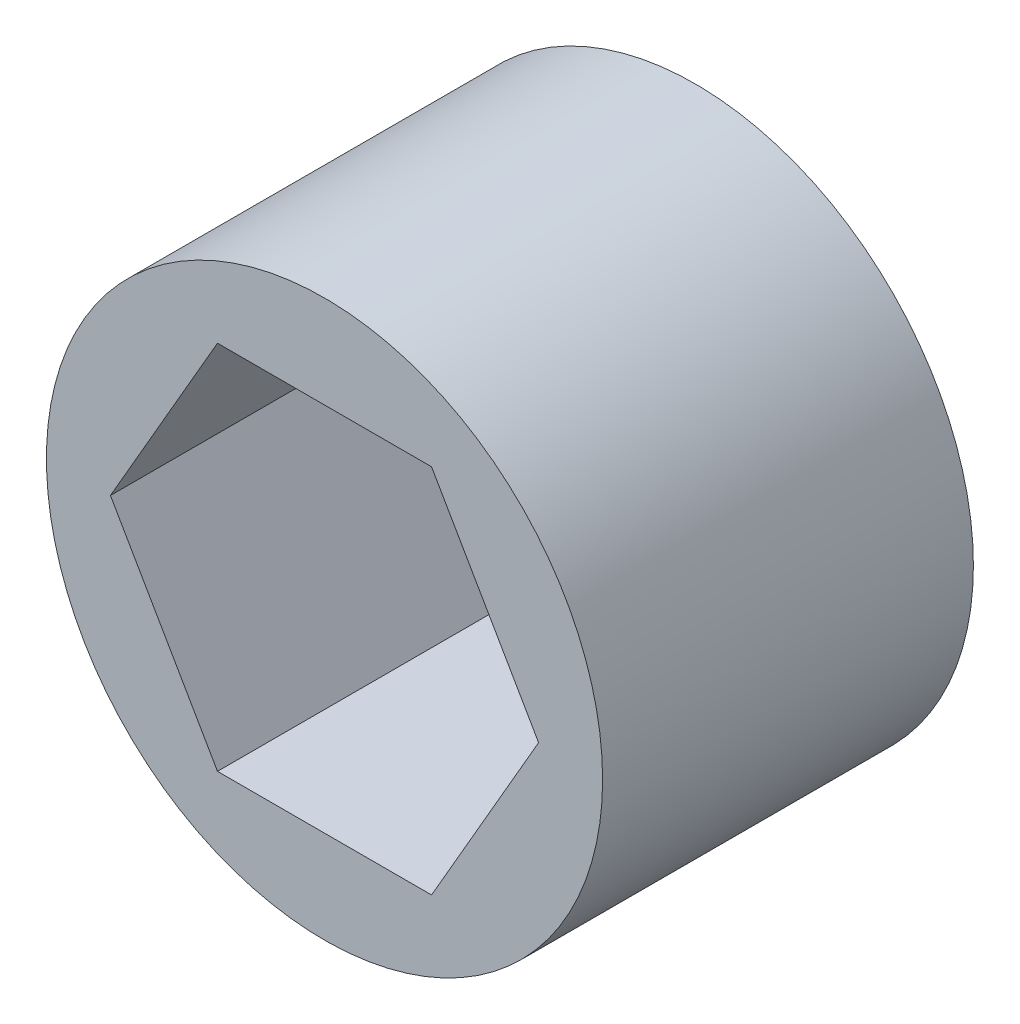
ISO-10303-21;
HEADER;
FILE_DESCRIPTION(('STEP AP214'),'2;1');
FILE_NAME('part.step','',(''),(''),'','','');
FILE_SCHEMA(('AUTOMOTIVE_DESIGN { 1 0 10303 214 1 1 1 1 }'));
ENDSEC;
DATA;
#1=APPLICATION_CONTEXT('core data for automotive mechanical design processes');
#2=APPLICATION_PROTOCOL_DEFINITION('international standard','automotive_design',2000,#1);
#3=PRODUCT_CONTEXT('',#1,'mechanical');
#4=PRODUCT('Part','Part','',(#3));
#5=PRODUCT_RELATED_PRODUCT_CATEGORY('part','',(#4));
#6=PRODUCT_DEFINITION_FORMATION('','',#4);
#7=PRODUCT_DEFINITION_CONTEXT('part definition',#1,'design');
#8=PRODUCT_DEFINITION('design','',#6,#7);
#9=PRODUCT_DEFINITION_SHAPE('','',#8);
#10=(LENGTH_UNIT() NAMED_UNIT(*) SI_UNIT(.MILLI.,.METRE.));
#11=(NAMED_UNIT(*) PLANE_ANGLE_UNIT() SI_UNIT($,.RADIAN.));
#12=(NAMED_UNIT(*) SI_UNIT($,.STERADIAN.) SOLID_ANGLE_UNIT());
#13=UNCERTAINTY_MEASURE_WITH_UNIT(LENGTH_MEASURE(1.E-05),#10,'distance_accuracy_value','');
#14=(GEOMETRIC_REPRESENTATION_CONTEXT(3) GLOBAL_UNCERTAINTY_ASSIGNED_CONTEXT((#13)) GLOBAL_UNIT_ASSIGNED_CONTEXT((#10,
#11,#12)) REPRESENTATION_CONTEXT('',''));
#15=CARTESIAN_POINT('',(0.,0.,0.));
#16=DIRECTION('',(0.,0.,1.));
#17=DIRECTION('',(1.,0.,0.));
#18=AXIS2_PLACEMENT_3D('',#15,#16,#17);
#19=CARTESIAN_POINT('',(0.,0.,12.7));
#20=DIRECTION('',(0.,0.,1.));
#21=DIRECTION('',(1.,0.,0.));
#22=AXIS2_PLACEMENT_3D('',#19,#20,#21);
#23=PLANE('',#22);
#24=CARTESIAN_POINT('',(0.,0.,12.7));
#25=DIRECTION('',(0.,0.,1.));
#26=DIRECTION('',(1.,0.,0.));
#27=AXIS2_PLACEMENT_3D('',#24,#25,#26);
#28=CIRCLE('',#27,9.525);
#29=CARTESIAN_POINT('',(9.525,0.,12.7));
#30=VERTEX_POINT('',#29);
#31=EDGE_CURVE('E11',#30,#30,#28,.T.);
#32=ORIENTED_EDGE('',*,*,#31,.T.);
#33=EDGE_LOOP('',(#32));
#34=FACE_BOUND('',#33,.T.);
#35=DIRECTION('',(-0.5,-0.866025403784439,0.));
#36=VECTOR('',#35,1.);
#37=CARTESIAN_POINT('',(-3.66617420935412,6.35,12.7));
#38=LINE('',#37,#36);
#39=CARTESIAN_POINT('',(-3.66617420935412,6.35,12.7));
#40=VERTEX_POINT('',#39);
#41=CARTESIAN_POINT('',(-7.33234841870825,0.,12.7));
#42=VERTEX_POINT('',#41);
#43=EDGE_CURVE('E98',#40,#42,#38,.T.);
#44=ORIENTED_EDGE('',*,*,#43,.F.);
#45=DIRECTION('',(-1.,0.,0.));
#46=VECTOR('',#45,1.);
#47=CARTESIAN_POINT('',(3.66617420935412,6.35,12.7));
#48=LINE('',#47,#46);
#49=CARTESIAN_POINT('',(3.66617420935412,6.35,12.7));
#50=VERTEX_POINT('',#49);
#51=EDGE_CURVE('E90',#50,#40,#48,.T.);
#52=ORIENTED_EDGE('',*,*,#51,.F.);
#53=DIRECTION('',(-0.5,0.866025403784439,0.));
#54=VECTOR('',#53,1.);
#55=CARTESIAN_POINT('',(7.33234841870825,0.,12.7));
#56=LINE('',#55,#54);
#57=CARTESIAN_POINT('',(7.33234841870825,0.,12.7));
#58=VERTEX_POINT('',#57);
#59=EDGE_CURVE('E118',#58,#50,#56,.T.);
#60=ORIENTED_EDGE('',*,*,#59,.F.);
#61=DIRECTION('',(0.5,0.866025403784439,0.));
#62=VECTOR('',#61,1.);
#63=CARTESIAN_POINT('',(3.66617420935413,-6.35,12.7));
#64=LINE('',#63,#62);
#65=CARTESIAN_POINT('',(3.66617420935413,-6.35,12.7));
#66=VERTEX_POINT('',#65);
#67=EDGE_CURVE('E116',#66,#58,#64,.T.);
#68=ORIENTED_EDGE('',*,*,#67,.F.);
#69=DIRECTION('',(1.,0.,0.));
#70=VECTOR('',#69,1.);
#71=CARTESIAN_POINT('',(-3.66617420935412,-6.35,12.7));
#72=LINE('',#71,#70);
#73=CARTESIAN_POINT('',(-3.66617420935412,-6.35,12.7));
#74=VERTEX_POINT('',#73);
#75=EDGE_CURVE('E112',#74,#66,#72,.T.);
#76=ORIENTED_EDGE('',*,*,#75,.F.);
#77=DIRECTION('',(0.5,-0.866025403784438,0.));
#78=VECTOR('',#77,1.);
#79=CARTESIAN_POINT('',(-7.33234841870825,0.,12.7));
#80=LINE('',#79,#78);
#81=EDGE_CURVE('E110',#42,#74,#80,.T.);
#82=ORIENTED_EDGE('',*,*,#81,.F.);
#83=EDGE_LOOP('',(#44,#52,#60,#68,#76,#82));
#84=FACE_BOUND('',#83,.T.);
#85=ADVANCED_FACE('F37',(#34,#84),#23,.T.);
#86=CARTESIAN_POINT('',(0.,0.,0.));
#87=DIRECTION('',(0.,0.,1.));
#88=DIRECTION('',(1.,0.,0.));
#89=AXIS2_PLACEMENT_3D('',#86,#87,#88);
#90=PLANE('',#89);
#91=CARTESIAN_POINT('',(0.,0.,0.));
#92=DIRECTION('',(0.,0.,1.));
#93=DIRECTION('',(1.,0.,0.));
#94=AXIS2_PLACEMENT_3D('',#91,#92,#93);
#95=CIRCLE('',#94,9.525);
#96=CARTESIAN_POINT('',(9.525,0.,0.));
#97=VERTEX_POINT('',#96);
#98=EDGE_CURVE('E41',#97,#97,#95,.T.);
#99=ORIENTED_EDGE('',*,*,#98,.F.);
#100=EDGE_LOOP('',(#99));
#101=FACE_BOUND('',#100,.T.);
#102=DIRECTION('',(-1.,0.,0.));
#103=VECTOR('',#102,1.);
#104=CARTESIAN_POINT('',(3.66617420935412,6.35,0.));
#105=LINE('',#104,#103);
#106=CARTESIAN_POINT('',(3.66617420935412,6.35,0.));
#107=VERTEX_POINT('',#106);
#108=CARTESIAN_POINT('',(-3.66617420935412,6.35,0.));
#109=VERTEX_POINT('',#108);
#110=EDGE_CURVE('E60',#107,#109,#105,.T.);
#111=ORIENTED_EDGE('',*,*,#110,.T.);
#112=DIRECTION('',(-0.5,-0.866025403784439,0.));
#113=VECTOR('',#112,1.);
#114=CARTESIAN_POINT('',(-3.66617420935412,6.35,0.));
#115=LINE('',#114,#113);
#116=CARTESIAN_POINT('',(-7.33234841870825,0.,0.));
#117=VERTEX_POINT('',#116);
#118=EDGE_CURVE('E105',#109,#117,#115,.T.);
#119=ORIENTED_EDGE('',*,*,#118,.T.);
#120=DIRECTION('',(0.5,-0.866025403784438,0.));
#121=VECTOR('',#120,1.);
#122=CARTESIAN_POINT('',(-7.33234841870825,0.,0.));
#123=LINE('',#122,#121);
#124=CARTESIAN_POINT('',(-3.66617420935412,-6.35,0.));
#125=VERTEX_POINT('',#124);
#126=EDGE_CURVE('E122',#117,#125,#123,.T.);
#127=ORIENTED_EDGE('',*,*,#126,.T.);
#128=DIRECTION('',(1.,0.,0.));
#129=VECTOR('',#128,1.);
#130=CARTESIAN_POINT('',(-3.66617420935412,-6.35,0.));
#131=LINE('',#130,#129);
#132=CARTESIAN_POINT('',(3.66617420935413,-6.35,0.));
#133=VERTEX_POINT('',#132);
#134=EDGE_CURVE('E125',#125,#133,#131,.T.);
#135=ORIENTED_EDGE('',*,*,#134,.T.);
#136=DIRECTION('',(0.5,0.866025403784439,0.));
#137=VECTOR('',#136,1.);
#138=CARTESIAN_POINT('',(3.66617420935413,-6.35,0.));
#139=LINE('',#138,#137);
#140=CARTESIAN_POINT('',(7.33234841870825,0.,0.));
#141=VERTEX_POINT('',#140);
#142=EDGE_CURVE('E128',#133,#141,#139,.T.);
#143=ORIENTED_EDGE('',*,*,#142,.T.);
#144=DIRECTION('',(-0.5,0.866025403784439,0.));
#145=VECTOR('',#144,1.);
#146=CARTESIAN_POINT('',(7.33234841870825,0.,0.));
#147=LINE('',#146,#145);
#148=EDGE_CURVE('E99',#141,#107,#147,.T.);
#149=ORIENTED_EDGE('',*,*,#148,.T.);
#150=EDGE_LOOP('',(#111,#119,#127,#135,#143,#149));
#151=FACE_BOUND('',#150,.T.);
#152=ADVANCED_FACE('F145',(#101,#151),#90,.F.);
#153=CARTESIAN_POINT('',(0.,0.,12.7));
#154=DIRECTION('',(0.,0.,-1.));
#155=DIRECTION('',(-1.,0.,0.));
#156=AXIS2_PLACEMENT_3D('',#153,#154,#155);
#157=CYLINDRICAL_SURFACE('',#156,9.525);
#158=ORIENTED_EDGE('',*,*,#31,.F.);
#159=EDGE_LOOP('',(#158));
#160=FACE_BOUND('',#159,.T.);
#161=ORIENTED_EDGE('',*,*,#98,.T.);
#162=EDGE_LOOP('',(#161));
#163=FACE_BOUND('',#162,.T.);
#164=ADVANCED_FACE('F39',(#160,#163),#157,.T.);
#165=CARTESIAN_POINT('',(3.66617420935412,6.35,12.7));
#166=DIRECTION('',(0.,-1.,0.));
#167=DIRECTION('',(1.,0.,0.));
#168=AXIS2_PLACEMENT_3D('',#165,#166,#167);
#169=PLANE('',#168);
#170=ORIENTED_EDGE('',*,*,#110,.F.);
#171=DIRECTION('',(0.,0.,-1.));
#172=VECTOR('',#171,1.);
#173=CARTESIAN_POINT('',(3.66617420935412,6.35,12.7));
#174=LINE('',#173,#172);
#175=EDGE_CURVE('E94',#50,#107,#174,.T.);
#176=ORIENTED_EDGE('',*,*,#175,.F.);
#177=ORIENTED_EDGE('',*,*,#51,.T.);
#178=DIRECTION('',(0.,0.,-1.));
#179=VECTOR('',#178,1.);
#180=CARTESIAN_POINT('',(-3.66617420935412,6.35,12.7));
#181=LINE('',#180,#179);
#182=EDGE_CURVE('E93',#40,#109,#181,.T.);
#183=ORIENTED_EDGE('',*,*,#182,.T.);
#184=EDGE_LOOP('',(#170,#176,#177,#183));
#185=FACE_BOUND('',#184,.T.);
#186=ADVANCED_FACE('F92',(#185),#169,.T.);
#187=CARTESIAN_POINT('',(-3.66617420935412,6.35,12.7));
#188=DIRECTION('',(0.866025403784439,-0.5,0.));
#189=DIRECTION('',(0.5,0.866025403784439,0.));
#190=AXIS2_PLACEMENT_3D('',#187,#188,#189);
#191=PLANE('',#190);
#192=ORIENTED_EDGE('',*,*,#118,.F.);
#193=ORIENTED_EDGE('',*,*,#182,.F.);
#194=ORIENTED_EDGE('',*,*,#43,.T.);
#195=DIRECTION('',(0.,0.,-1.));
#196=VECTOR('',#195,1.);
#197=CARTESIAN_POINT('',(-7.33234841870825,0.,12.7));
#198=LINE('',#197,#196);
#199=EDGE_CURVE('E106',#42,#117,#198,.T.);
#200=ORIENTED_EDGE('',*,*,#199,.T.);
#201=EDGE_LOOP('',(#192,#193,#194,#200));
#202=FACE_BOUND('',#201,.T.);
#203=ADVANCED_FACE('F102',(#202),#191,.T.);
#204=CARTESIAN_POINT('',(-7.33234841870825,0.,12.7));
#205=DIRECTION('',(0.866025403784438,0.5,0.));
#206=DIRECTION('',(-0.5,0.866025403784438,0.));
#207=AXIS2_PLACEMENT_3D('',#204,#205,#206);
#208=PLANE('',#207);
#209=ORIENTED_EDGE('',*,*,#126,.F.);
#210=ORIENTED_EDGE('',*,*,#199,.F.);
#211=ORIENTED_EDGE('',*,*,#81,.T.);
#212=DIRECTION('',(0.,0.,-1.));
#213=VECTOR('',#212,1.);
#214=CARTESIAN_POINT('',(-3.66617420935412,-6.35,12.7));
#215=LINE('',#214,#213);
#216=EDGE_CURVE('E137',#74,#125,#215,.T.);
#217=ORIENTED_EDGE('',*,*,#216,.T.);
#218=EDGE_LOOP('',(#209,#210,#211,#217));
#219=FACE_BOUND('',#218,.T.);
#220=ADVANCED_FACE('F141',(#219),#208,.T.);
#221=CARTESIAN_POINT('',(-3.66617420935412,-6.35,12.7));
#222=DIRECTION('',(0.,1.,0.));
#223=DIRECTION('',(-1.,0.,0.));
#224=AXIS2_PLACEMENT_3D('',#221,#222,#223);
#225=PLANE('',#224);
#226=ORIENTED_EDGE('',*,*,#134,.F.);
#227=ORIENTED_EDGE('',*,*,#216,.F.);
#228=ORIENTED_EDGE('',*,*,#75,.T.);
#229=DIRECTION('',(0.,0.,-1.));
#230=VECTOR('',#229,1.);
#231=CARTESIAN_POINT('',(3.66617420935413,-6.35,12.7));
#232=LINE('',#231,#230);
#233=EDGE_CURVE('E135',#66,#133,#232,.T.);
#234=ORIENTED_EDGE('',*,*,#233,.T.);
#235=EDGE_LOOP('',(#226,#227,#228,#234));
#236=FACE_BOUND('',#235,.T.);
#237=ADVANCED_FACE('F153',(#236),#225,.T.);
#238=CARTESIAN_POINT('',(3.66617420935413,-6.35,12.7));
#239=DIRECTION('',(-0.866025403784439,0.5,0.));
#240=DIRECTION('',(-0.5,-0.866025403784439,0.));
#241=AXIS2_PLACEMENT_3D('',#238,#239,#240);
#242=PLANE('',#241);
#243=ORIENTED_EDGE('',*,*,#142,.F.);
#244=ORIENTED_EDGE('',*,*,#233,.F.);
#245=ORIENTED_EDGE('',*,*,#67,.T.);
#246=DIRECTION('',(0.,0.,-1.));
#247=VECTOR('',#246,1.);
#248=CARTESIAN_POINT('',(7.33234841870825,0.,12.7));
#249=LINE('',#248,#247);
#250=EDGE_CURVE('E52',#58,#141,#249,.T.);
#251=ORIENTED_EDGE('',*,*,#250,.T.);
#252=EDGE_LOOP('',(#243,#244,#245,#251));
#253=FACE_BOUND('',#252,.T.);
#254=ADVANCED_FACE('F151',(#253),#242,.T.);
#255=CARTESIAN_POINT('',(7.33234841870825,0.,12.7));
#256=DIRECTION('',(-0.866025403784439,-0.5,0.));
#257=DIRECTION('',(0.5,-0.866025403784439,0.));
#258=AXIS2_PLACEMENT_3D('',#255,#256,#257);
#259=PLANE('',#258);
#260=ORIENTED_EDGE('',*,*,#148,.F.);
#261=ORIENTED_EDGE('',*,*,#250,.F.);
#262=ORIENTED_EDGE('',*,*,#59,.T.);
#263=ORIENTED_EDGE('',*,*,#175,.T.);
#264=EDGE_LOOP('',(#260,#261,#262,#263));
#265=FACE_BOUND('',#264,.T.);
#266=ADVANCED_FACE('F147',(#265),#259,.T.);
#267=CLOSED_SHELL('',(#85,#152,#164,#186,#203,#220,#237,#254,#266));
#268=MANIFOLD_SOLID_BREP('B2',#267);
#269=ADVANCED_BREP_SHAPE_REPRESENTATION('',(#18,#268),#14);
#270=SHAPE_DEFINITION_REPRESENTATION(#9,#269);
ENDSEC;
END-ISO-10303-21;
